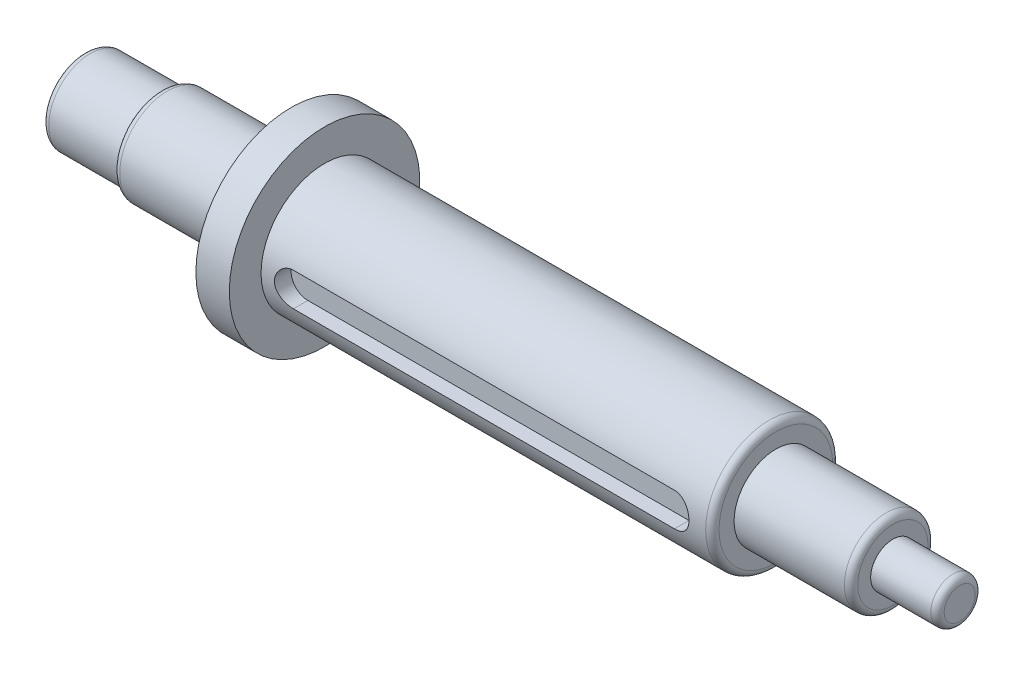
ISO-10303-21;
HEADER;
FILE_DESCRIPTION(('STEP AP214'),'2;1');
FILE_NAME('part.step','',(''),(''),'','','');
FILE_SCHEMA(('AUTOMOTIVE_DESIGN { 1 0 10303 214 1 1 1 1 }'));
ENDSEC;
DATA;
#1=APPLICATION_CONTEXT('core data for automotive mechanical design processes');
#2=APPLICATION_PROTOCOL_DEFINITION('international standard','automotive_design',2000,#1);
#3=PRODUCT_CONTEXT('',#1,'mechanical');
#4=PRODUCT('Part','Part','',(#3));
#5=PRODUCT_RELATED_PRODUCT_CATEGORY('part','',(#4));
#6=PRODUCT_DEFINITION_FORMATION('','',#4);
#7=PRODUCT_DEFINITION_CONTEXT('part definition',#1,'design');
#8=PRODUCT_DEFINITION('design','',#6,#7);
#9=PRODUCT_DEFINITION_SHAPE('','',#8);
#10=(LENGTH_UNIT() NAMED_UNIT(*) SI_UNIT(.MILLI.,.METRE.));
#11=(NAMED_UNIT(*) PLANE_ANGLE_UNIT() SI_UNIT($,.RADIAN.));
#12=(NAMED_UNIT(*) SI_UNIT($,.STERADIAN.) SOLID_ANGLE_UNIT());
#13=UNCERTAINTY_MEASURE_WITH_UNIT(LENGTH_MEASURE(1.E-05),#10,'distance_accuracy_value','');
#14=(GEOMETRIC_REPRESENTATION_CONTEXT(3) GLOBAL_UNCERTAINTY_ASSIGNED_CONTEXT((#13)) GLOBAL_UNIT_ASSIGNED_CONTEXT((#10,
#11,#12)) REPRESENTATION_CONTEXT('',''));
#15=CARTESIAN_POINT('',(0.,0.,0.));
#16=DIRECTION('',(0.,0.,1.));
#17=DIRECTION('',(1.,0.,0.));
#18=AXIS2_PLACEMENT_3D('',#15,#16,#17);
#19=CARTESIAN_POINT('',(0.,0.,0.));
#20=DIRECTION('',(1.,0.,0.));
#21=DIRECTION('',(0.,0.,-1.));
#22=AXIS2_PLACEMENT_3D('',#19,#20,#21);
#23=PLANE('',#22);
#24=CARTESIAN_POINT('',(0.,0.,0.));
#25=DIRECTION('',(1.,0.,0.));
#26=DIRECTION('',(0.,0.,-1.));
#27=AXIS2_PLACEMENT_3D('',#24,#25,#26);
#28=CIRCLE('',#27,10.5);
#29=CARTESIAN_POINT('',(0.,0.,-10.5));
#30=VERTEX_POINT('',#29);
#31=EDGE_CURVE('E147',#30,#30,#28,.F.);
#32=ORIENTED_EDGE('',*,*,#31,.T.);
#33=EDGE_LOOP('',(#32));
#34=FACE_BOUND('',#33,.T.);
#35=ADVANCED_FACE('F36',(#34),#23,.F.);
#36=CARTESIAN_POINT('',(0.,0.,0.));
#37=DIRECTION('',(-1.,0.,0.));
#38=DIRECTION('',(0.,0.,1.));
#39=AXIS2_PLACEMENT_3D('',#36,#37,#38);
#40=CYLINDRICAL_SURFACE('',#39,12.5);
#41=CARTESIAN_POINT('',(2.,0.,0.));
#42=DIRECTION('',(1.,0.,0.));
#43=DIRECTION('',(0.,0.,-1.));
#44=AXIS2_PLACEMENT_3D('',#41,#42,#43);
#45=CIRCLE('',#44,12.5);
#46=CARTESIAN_POINT('',(2.,0.,-12.5));
#47=VERTEX_POINT('',#46);
#48=EDGE_CURVE('E150',#47,#47,#45,.T.);
#49=ORIENTED_EDGE('',*,*,#48,.T.);
#50=EDGE_LOOP('',(#49));
#51=FACE_BOUND('',#50,.T.);
#52=CARTESIAN_POINT('',(23.,0.,0.));
#53=DIRECTION('',(-1.,0.,0.));
#54=DIRECTION('',(0.,0.,1.));
#55=AXIS2_PLACEMENT_3D('',#52,#53,#54);
#56=CIRCLE('',#55,12.5);
#57=CARTESIAN_POINT('',(23.,0.,12.5));
#58=VERTEX_POINT('',#57);
#59=EDGE_CURVE('E123',#58,#58,#56,.T.);
#60=ORIENTED_EDGE('',*,*,#59,.T.);
#61=EDGE_LOOP('',(#60));
#62=FACE_BOUND('',#61,.T.);
#63=ADVANCED_FACE('F209',(#51,#62),#40,.T.);
#64=CARTESIAN_POINT('',(0.,0.,0.));
#65=DIRECTION('',(-1.,0.,0.));
#66=DIRECTION('',(0.,0.,1.));
#67=AXIS2_PLACEMENT_3D('',#64,#65,#66);
#68=CYLINDRICAL_SURFACE('',#67,14.2499999999997);
#69=CARTESIAN_POINT('',(24.9843134832984,0.,0.));
#70=DIRECTION('',(-1.,0.,0.));
#71=DIRECTION('',(0.,0.,1.));
#72=AXIS2_PLACEMENT_3D('',#69,#70,#71);
#73=CIRCLE('',#72,14.2499999999997);
#74=CARTESIAN_POINT('',(24.9843134832984,0.,14.2499999999997));
#75=VERTEX_POINT('',#74);
#76=EDGE_CURVE('E144',#75,#75,#73,.F.);
#77=ORIENTED_EDGE('',*,*,#76,.T.);
#78=EDGE_LOOP('',(#77));
#79=FACE_BOUND('',#78,.T.);
#80=CARTESIAN_POINT('',(62.,0.,0.));
#81=DIRECTION('',(-1.,0.,0.));
#82=DIRECTION('',(0.,0.,1.));
#83=AXIS2_PLACEMENT_3D('',#80,#81,#82);
#84=CIRCLE('',#83,14.2499999999997);
#85=CARTESIAN_POINT('',(62.,0.,14.2499999999997));
#86=VERTEX_POINT('',#85);
#87=EDGE_CURVE('E120',#86,#86,#84,.T.);
#88=ORIENTED_EDGE('',*,*,#87,.T.);
#89=EDGE_LOOP('',(#88));
#90=FACE_BOUND('',#89,.T.);
#91=ADVANCED_FACE('F215',(#79,#90),#68,.T.);
#92=CARTESIAN_POINT('',(62.,0.,-14.2499999999997));
#93=DIRECTION('',(1.,0.,0.));
#94=DIRECTION('',(0.,0.,-1.));
#95=AXIS2_PLACEMENT_3D('',#92,#93,#94);
#96=PLANE('',#95);
#97=ORIENTED_EDGE('',*,*,#87,.F.);
#98=EDGE_LOOP('',(#97));
#99=FACE_BOUND('',#98,.T.);
#100=CARTESIAN_POINT('',(62.,0.,0.));
#101=DIRECTION('',(-1.,0.,0.));
#102=DIRECTION('',(0.,0.,1.));
#103=AXIS2_PLACEMENT_3D('',#100,#101,#102);
#104=CIRCLE('',#103,28.4999999999991);
#105=CARTESIAN_POINT('',(62.,0.,28.4999999999991));
#106=VERTEX_POINT('',#105);
#107=EDGE_CURVE('E117',#106,#106,#104,.T.);
#108=ORIENTED_EDGE('',*,*,#107,.T.);
#109=EDGE_LOOP('',(#108));
#110=FACE_BOUND('',#109,.T.);
#111=ADVANCED_FACE('F244',(#99,#110),#96,.F.);
#112=CARTESIAN_POINT('',(0.,0.,0.));
#113=DIRECTION('',(-1.,0.,0.));
#114=DIRECTION('',(0.,0.,1.));
#115=AXIS2_PLACEMENT_3D('',#112,#113,#114);
#116=CYLINDRICAL_SURFACE('',#115,28.4999999999996);
#117=ORIENTED_EDGE('',*,*,#107,.F.);
#118=EDGE_LOOP('',(#117));
#119=FACE_BOUND('',#118,.T.);
#120=CARTESIAN_POINT('',(72.,0.,0.));
#121=DIRECTION('',(-1.,0.,0.));
#122=DIRECTION('',(0.,0.,1.));
#123=AXIS2_PLACEMENT_3D('',#120,#121,#122);
#124=CIRCLE('',#123,28.5);
#125=CARTESIAN_POINT('',(72.,0.,28.5));
#126=VERTEX_POINT('',#125);
#127=EDGE_CURVE('E114',#126,#126,#124,.T.);
#128=ORIENTED_EDGE('',*,*,#127,.T.);
#129=EDGE_LOOP('',(#128));
#130=FACE_BOUND('',#129,.T.);
#131=ADVANCED_FACE('F249',(#119,#130),#116,.T.);
#132=CARTESIAN_POINT('',(72.,0.,-28.5));
#133=DIRECTION('',(-1.,0.,0.));
#134=DIRECTION('',(0.,0.,1.));
#135=AXIS2_PLACEMENT_3D('',#132,#133,#134);
#136=PLANE('',#135);
#137=ORIENTED_EDGE('',*,*,#127,.F.);
#138=EDGE_LOOP('',(#137));
#139=FACE_BOUND('',#138,.T.);
#140=CARTESIAN_POINT('',(72.,0.,0.));
#141=DIRECTION('',(-1.,0.,0.));
#142=DIRECTION('',(0.,0.,1.));
#143=AXIS2_PLACEMENT_3D('',#140,#141,#142);
#144=CIRCLE('',#143,19.);
#145=CARTESIAN_POINT('',(72.,0.,19.));
#146=VERTEX_POINT('',#145);
#147=EDGE_CURVE('E111',#146,#146,#144,.T.);
#148=ORIENTED_EDGE('',*,*,#147,.T.);
#149=EDGE_LOOP('',(#148));
#150=FACE_BOUND('',#149,.T.);
#151=ADVANCED_FACE('F205',(#139,#150),#136,.F.);
#152=CARTESIAN_POINT('',(0.,0.,0.));
#153=DIRECTION('',(-1.,0.,0.));
#154=DIRECTION('',(0.,0.,1.));
#155=AXIS2_PLACEMENT_3D('',#152,#153,#154);
#156=CYLINDRICAL_SURFACE('',#155,19.);
#157=DIRECTION('',(-1.,0.,0.));
#158=VECTOR('',#157,1.);
#159=CARTESIAN_POINT('',(0.,5.,18.3303027798234));
#160=LINE('',#159,#158);
#161=CARTESIAN_POINT('',(81.,5.,18.3303027798234));
#162=VERTEX_POINT('',#161);
#163=CARTESIAN_POINT('',(195.,5.,18.3303027798234));
#164=VERTEX_POINT('',#163);
#165=EDGE_CURVE('E11',#162,#164,#160,.F.);
#166=ORIENTED_EDGE('',*,*,#165,.T.);
#167=CARTESIAN_POINT('',(195.,5.,18.3303027798234));
#168=CARTESIAN_POINT('',(195.138016197201,5.00001766668261,18.3302859082857));
#169=CARTESIAN_POINT('',(195.276026196084,4.9942862066955,18.3318609913296));
#170=CARTESIAN_POINT('',(195.551009053571,4.97145574831055,18.3380720236008));
#171=CARTESIAN_POINT('',(195.687982096282,4.95435881807958,18.3427074159445));
#172=CARTESIAN_POINT('',(195.959630101042,4.90897601752026,18.3549032155987));
#173=CARTESIAN_POINT('',(196.094309305362,4.88071385252822,18.3624574251155));
#174=CARTESIAN_POINT('',(196.360713798261,4.81324620313061,18.3802580223183));
#175=CARTESIAN_POINT('',(196.492439037366,4.77404053558504,18.3905044550585));
#176=CARTESIAN_POINT('',(196.751988221275,4.68501289335865,18.4133853968542));
#177=CARTESIAN_POINT('',(196.879813631962,4.63519496528777,18.4260189954416));
#178=CARTESIAN_POINT('',(197.130780361131,4.52532553542391,18.4533094170246));
#179=CARTESIAN_POINT('',(197.253919920243,4.4652702353424,18.4679669905744));
#180=CARTESIAN_POINT('',(197.615064428344,4.27037749337004,18.5143659713688));
#181=CARTESIAN_POINT('',(197.844987340861,4.12074697519633,18.5485515146361));
#182=CARTESIAN_POINT('',(198.281689372965,3.78266195018416,18.6204696894086));
#183=CARTESIAN_POINT('',(198.487853211862,3.59343075278062,18.658263492612));
#184=CARTESIAN_POINT('',(198.865962445014,3.18310193538118,18.732625835079));
#185=CARTESIAN_POINT('',(199.037902303546,2.96199917012089,18.76919417533));
#186=CARTESIAN_POINT('',(199.345179414361,2.48996924780925,18.8376675811324));
#187=CARTESIAN_POINT('',(199.47990528927,2.23863143936238,18.8694912031433));
#188=CARTESIAN_POINT('',(199.704953482289,1.71590637997249,18.9241806310349));
#189=CARTESIAN_POINT('',(199.795285199543,1.44452338700981,18.9470483328572));
#190=CARTESIAN_POINT('',(199.92699709216,0.895832897884265,18.9808144065777));
#191=CARTESIAN_POINT('',(199.969425143628,0.618792947064016,18.9919686097243));
#192=CARTESIAN_POINT('',(200.007420968747,0.0613112052362544,19.0019448285789));
#193=CARTESIAN_POINT('',(200.002995365607,-0.219130099359579,19.0007685873121));
#194=CARTESIAN_POINT('',(199.948151367512,-0.768151117298725,18.9864044979906));
#195=CARTESIAN_POINT('',(199.898865805523,-1.03685296683871,18.9735125161181));
#196=CARTESIAN_POINT('',(199.757520254621,-1.562032997849,18.9375121568335));
#197=CARTESIAN_POINT('',(199.665458264849,-1.81851060691425,18.9144033015318));
#198=CARTESIAN_POINT('',(199.440328822091,-2.3148475496931,18.8601298911963));
#199=CARTESIAN_POINT('',(199.306869759603,-2.55452016615558,18.8288888816724));
#200=CARTESIAN_POINT('',(199.002903285257,-3.00854301144997,18.7616994100197));
#201=CARTESIAN_POINT('',(198.832389585279,-3.22288893283456,18.7257501493189));
#202=CARTESIAN_POINT('',(198.549627331325,-3.52419659305494,18.6705907034911));
#203=CARTESIAN_POINT('',(198.449181247553,-3.62255621938199,18.6517101060183));
#204=CARTESIAN_POINT('',(198.240350624317,-3.81048914275926,18.6142238908637));
#205=CARTESIAN_POINT('',(198.131968878581,-3.90006550620352,18.595618179155));
#206=CARTESIAN_POINT('',(197.907893486203,-4.06988196131281,18.5591922415691));
#207=CARTESIAN_POINT('',(197.792195054692,-4.15011584380694,18.5413725429207));
#208=CARTESIAN_POINT('',(197.55434791851,-4.30059289814721,18.5070487697456));
#209=CARTESIAN_POINT('',(197.432201736368,-4.3708399379606,18.4905441869608));
#210=CARTESIAN_POINT('',(197.18137777788,-4.50130100976656,18.4592205654969));
#211=CARTESIAN_POINT('',(197.052661056413,-4.56144316630362,18.4444138217068));
#212=CARTESIAN_POINT('',(196.79041951867,-4.67060599397033,18.4170737812662));
#213=CARTESIAN_POINT('',(196.656896658259,-4.71963113120058,18.4045395720651));
#214=CARTESIAN_POINT('',(196.386096701654,-4.80613348025077,18.3821401987773));
#215=CARTESIAN_POINT('',(196.248823661148,-4.84362266837274,18.3722722679413));
#216=CARTESIAN_POINT('',(195.971463873974,-4.90677851660471,18.3555057309761));
#217=CARTESIAN_POINT('',(195.831378472033,-4.93245069281332,18.3486057395322));
#218=CARTESIAN_POINT('',(195.576031992547,-4.96805016310397,18.3389956133326));
#219=CARTESIAN_POINT('',(195.461073574541,-4.98003415018343,18.3357406080542));
#220=CARTESIAN_POINT('',(195.230746570727,-4.99600639007608,18.3313920220704));
#221=CARTESIAN_POINT('',(195.115378930817,-5.00000735763538,18.3302950043258));
#222=CARTESIAN_POINT('',(195.,-5.,18.3303027798234));
#223=B_SPLINE_CURVE_WITH_KNOTS('',3,(#167,#168,#169,#170,#171,#172,#173,#174,#175,#176,#177,
#178,#179,#180,#181,#182,#183,#184,#185,#186,#187,#188,#189,#190,#191,#192,#193,#194,#195,#196,
#197,#198,#199,#200,#201,#202,#203,#204,#205,#206,#207,#208,#209,#210,#211,#212,#213,#214,#215,
#216,#217,#218,#219,#220,#221,#222),.UNSPECIFIED.,.F.,.F.,(4,2,2,2,2,2,2,2,2,2,2,2,2,2,2,2,2,2,
2,2,2,2,2,2,2,2,2,4),(0.,0.413911055875678,0.827746813248318,1.24070862177833,1.65367734165684,
2.06648887151099,2.47945389814992,3.30477934860257,4.14813364543848,4.99162424403129,
5.84824381544334,6.70468194490244,7.54199904887894,8.3791977917408,9.19582441640862,
10.0124892424595,10.8371281703848,11.6619071478274,12.0870382665453,12.5120204319564,
12.9372834547274,13.3623813190941,13.7903854272744,14.2182172852097,14.6456034696819,
15.0727899504498,15.4193832237595,15.7654240276075),.UNSPECIFIED.);
#224=CARTESIAN_POINT('',(195.,-5.,18.3303027798234));
#225=VERTEX_POINT('',#224);
#226=EDGE_CURVE('E153',#164,#225,#223,.T.);
#227=ORIENTED_EDGE('',*,*,#226,.T.);
#228=DIRECTION('',(-1.,0.,0.));
#229=VECTOR('',#228,1.);
#230=CARTESIAN_POINT('',(0.,-5.,18.3303027798234));
#231=LINE('',#230,#229);
#232=CARTESIAN_POINT('',(81.,-5.,18.3303027798234));
#233=VERTEX_POINT('',#232);
#234=EDGE_CURVE('E44',#225,#233,#231,.T.);
#235=ORIENTED_EDGE('',*,*,#234,.T.);
#236=CARTESIAN_POINT('',(81.,-5.,18.3303027798234));
#237=CARTESIAN_POINT('',(80.8619838027993,-5.00001766668261,18.3302859082857));
#238=CARTESIAN_POINT('',(80.7239738039157,-4.9942862066955,18.3318609913296));
#239=CARTESIAN_POINT('',(80.4489909464293,-4.97145574831054,18.3380720236008));
#240=CARTESIAN_POINT('',(80.3120179037179,-4.95435881807958,18.3427074159445));
#241=CARTESIAN_POINT('',(80.0403698989582,-4.90897601752026,18.3549032155987));
#242=CARTESIAN_POINT('',(79.9056906946382,-4.88071385252822,18.3624574251155));
#243=CARTESIAN_POINT('',(79.6392862017387,-4.8132462031306,18.3802580223183));
#244=CARTESIAN_POINT('',(79.5075609626339,-4.77404053558503,18.3905044550585));
#245=CARTESIAN_POINT('',(79.2480117787245,-4.68501289335864,18.4133853968542));
#246=CARTESIAN_POINT('',(79.1201863680384,-4.63519496528777,18.4260189954416));
#247=CARTESIAN_POINT('',(78.8692196388691,-4.5253255354239,18.4533094170246));
#248=CARTESIAN_POINT('',(78.7460800797571,-4.46527023534238,18.4679669905744));
#249=CARTESIAN_POINT('',(78.3849355716565,-4.27037749337002,18.5143659713688));
#250=CARTESIAN_POINT('',(78.1550126591395,-4.12074697519632,18.5485515146361));
#251=CARTESIAN_POINT('',(77.7183106270352,-3.78266195018417,18.6204696894086));
#252=CARTESIAN_POINT('',(77.5121467881376,-3.59343075278062,18.658263492612));
#253=CARTESIAN_POINT('',(77.1340375549857,-3.18310193538118,18.732625835079));
#254=CARTESIAN_POINT('',(76.9620976964542,-2.9619991701209,18.76919417533));
#255=CARTESIAN_POINT('',(76.6548205856393,-2.48996924780925,18.8376675811324));
#256=CARTESIAN_POINT('',(76.5200947107301,-2.23863143936237,18.8694912031433));
#257=CARTESIAN_POINT('',(76.2950465177109,-1.71590637997248,18.9241806310349));
#258=CARTESIAN_POINT('',(76.2047148004574,-1.44452338700979,18.9470483328572));
#259=CARTESIAN_POINT('',(76.0730029078404,-0.895832897884248,18.9808144065777));
#260=CARTESIAN_POINT('',(76.0305748563723,-0.618792947064001,18.9919686097243));
#261=CARTESIAN_POINT('',(75.9925790312525,-0.0613112052362446,19.0019448285789));
#262=CARTESIAN_POINT('',(75.9970046343934,0.219130099359585,19.0007685873121));
#263=CARTESIAN_POINT('',(76.0518486324882,0.768151117298726,18.9864044979906));
#264=CARTESIAN_POINT('',(76.1011341944768,1.03685296683871,18.9735125161181));
#265=CARTESIAN_POINT('',(76.2424797453791,1.56203299784899,18.9375121568335));
#266=CARTESIAN_POINT('',(76.3345417351512,1.81851060691424,18.9144033015318));
#267=CARTESIAN_POINT('',(76.5596711779087,2.3148475496931,18.8601298911963));
#268=CARTESIAN_POINT('',(76.6931302403975,2.55452016615559,18.8288888816724));
#269=CARTESIAN_POINT('',(76.9970967147432,3.00854301144998,18.7616994100197));
#270=CARTESIAN_POINT('',(77.1676104147209,3.22288893283458,18.7257501493189));
#271=CARTESIAN_POINT('',(77.4503726686754,3.52419659305494,18.6705907034911));
#272=CARTESIAN_POINT('',(77.5508187524467,3.62255621938198,18.6517101060183));
#273=CARTESIAN_POINT('',(77.7596493756834,3.81048914275925,18.6142238908637));
#274=CARTESIAN_POINT('',(77.8680311214193,3.90006550620351,18.5956181791551));
#275=CARTESIAN_POINT('',(78.0921065137967,4.0698819613128,18.5591922415691));
#276=CARTESIAN_POINT('',(78.2078049453085,4.15011584380694,18.5413725429207));
#277=CARTESIAN_POINT('',(78.4456520814902,4.3005928981472,18.5070487697456));
#278=CARTESIAN_POINT('',(78.5677982636319,4.37083993796059,18.4905441869608));
#279=CARTESIAN_POINT('',(78.8186222221203,4.50130100976655,18.4592205654969));
#280=CARTESIAN_POINT('',(78.9473389435871,4.56144316630361,18.4444138217068));
#281=CARTESIAN_POINT('',(79.2095804813299,4.67060599397032,18.4170737812662));
#282=CARTESIAN_POINT('',(79.3431033417405,4.71963113120057,18.4045395720651));
#283=CARTESIAN_POINT('',(79.6139032983456,4.80613348025077,18.3821401987773));
#284=CARTESIAN_POINT('',(79.7511763388523,4.84362266837273,18.3722722679413));
#285=CARTESIAN_POINT('',(80.028536126026,4.90677851660471,18.3555057309761));
#286=CARTESIAN_POINT('',(80.1686215279673,4.93245069281332,18.3486057395322));
#287=CARTESIAN_POINT('',(80.423968007453,4.96805016310397,18.3389956133326));
#288=CARTESIAN_POINT('',(80.5389264254594,4.98003415018343,18.3357406080542));
#289=CARTESIAN_POINT('',(80.7692534292732,4.99600639007608,18.3313920220704));
#290=CARTESIAN_POINT('',(80.884621069183,5.00000735763538,18.3302950043258));
#291=CARTESIAN_POINT('',(81.,5.,18.3303027798234));
#292=B_SPLINE_CURVE_WITH_KNOTS('',3,(#236,#237,#238,#239,#240,#241,#242,#243,#244,#245,#246,
#247,#248,#249,#250,#251,#252,#253,#254,#255,#256,#257,#258,#259,#260,#261,#262,#263,#264,#265,
#266,#267,#268,#269,#270,#271,#272,#273,#274,#275,#276,#277,#278,#279,#280,#281,#282,#283,#284,
#285,#286,#287,#288,#289,#290,#291),.UNSPECIFIED.,.F.,.F.,(4,2,2,2,2,2,2,2,2,2,2,2,2,2,2,2,2,2,
2,2,2,2,2,2,2,2,2,4),(0.,0.413911055875692,0.827746813248346,1.24070862177839,1.65367734165684,
2.06648887151102,2.47945389814994,3.30477934860257,4.14813364543846,4.99162424403128,
5.84824381544335,6.70468194490246,7.54199904887896,8.37919779174081,9.19582441640863,
10.0124892424595,10.8371281703848,11.6619071478275,12.0870382665453,12.5120204319564,
12.9372834547274,13.3623813190941,13.7903854272744,14.2182172852097,14.6456034696819,
15.0727899504498,15.4193832237595,15.7654240276075),.UNSPECIFIED.);
#293=EDGE_CURVE('E51',#233,#162,#292,.T.);
#294=ORIENTED_EDGE('',*,*,#293,.T.);
#295=EDGE_LOOP('',(#166,#227,#235,#294));
#296=FACE_BOUND('',#295,.T.);
#297=CARTESIAN_POINT('',(205.,0.,0.));
#298=DIRECTION('',(-1.,0.,0.));
#299=DIRECTION('',(0.,0.,1.));
#300=AXIS2_PLACEMENT_3D('',#297,#298,#299);
#301=CIRCLE('',#300,19.);
#302=CARTESIAN_POINT('',(205.,0.,19.));
#303=VERTEX_POINT('',#302);
#304=EDGE_CURVE('E138',#303,#303,#301,.T.);
#305=ORIENTED_EDGE('',*,*,#304,.T.);
#306=EDGE_LOOP('',(#305));
#307=FACE_BOUND('',#306,.T.);
#308=ORIENTED_EDGE('',*,*,#147,.F.);
#309=EDGE_LOOP('',(#308));
#310=FACE_BOUND('',#309,.T.);
#311=ADVANCED_FACE('F167',(#296,#307,#310),#156,.T.);
#312=CARTESIAN_POINT('',(207.,0.,-19.));
#313=DIRECTION('',(-1.,0.,0.));
#314=DIRECTION('',(0.,0.,1.));
#315=AXIS2_PLACEMENT_3D('',#312,#313,#314);
#316=PLANE('',#315);
#317=CARTESIAN_POINT('',(207.,0.,0.));
#318=DIRECTION('',(-1.,0.,0.));
#319=DIRECTION('',(0.,0.,1.));
#320=AXIS2_PLACEMENT_3D('',#317,#318,#319);
#321=CIRCLE('',#320,17.);
#322=CARTESIAN_POINT('',(207.,0.,17.));
#323=VERTEX_POINT('',#322);
#324=EDGE_CURVE('E141',#323,#323,#321,.F.);
#325=ORIENTED_EDGE('',*,*,#324,.T.);
#326=EDGE_LOOP('',(#325));
#327=FACE_BOUND('',#326,.T.);
#328=CARTESIAN_POINT('',(207.,0.,0.));
#329=DIRECTION('',(-1.,0.,0.));
#330=DIRECTION('',(0.,0.,1.));
#331=AXIS2_PLACEMENT_3D('',#328,#329,#330);
#332=CIRCLE('',#331,12.5);
#333=CARTESIAN_POINT('',(207.,0.,12.5));
#334=VERTEX_POINT('',#333);
#335=EDGE_CURVE('E108',#334,#334,#332,.T.);
#336=ORIENTED_EDGE('',*,*,#335,.T.);
#337=EDGE_LOOP('',(#336));
#338=FACE_BOUND('',#337,.T.);
#339=ADVANCED_FACE('F198',(#327,#338),#316,.F.);
#340=CARTESIAN_POINT('',(0.,0.,0.));
#341=DIRECTION('',(-1.,0.,0.));
#342=DIRECTION('',(0.,0.,1.));
#343=AXIS2_PLACEMENT_3D('',#340,#341,#342);
#344=CYLINDRICAL_SURFACE('',#343,12.5);
#345=CARTESIAN_POINT('',(240.,0.,0.));
#346=DIRECTION('',(-1.,0.,0.));
#347=DIRECTION('',(0.,0.,1.));
#348=AXIS2_PLACEMENT_3D('',#345,#346,#347);
#349=CIRCLE('',#348,12.5);
#350=CARTESIAN_POINT('',(240.,0.,12.5));
#351=VERTEX_POINT('',#350);
#352=EDGE_CURVE('E132',#351,#351,#349,.T.);
#353=ORIENTED_EDGE('',*,*,#352,.T.);
#354=EDGE_LOOP('',(#353));
#355=FACE_BOUND('',#354,.T.);
#356=ORIENTED_EDGE('',*,*,#335,.F.);
#357=EDGE_LOOP('',(#356));
#358=FACE_BOUND('',#357,.T.);
#359=ADVANCED_FACE('F195',(#355,#358),#344,.T.);
#360=CARTESIAN_POINT('',(242.,0.,-12.5));
#361=DIRECTION('',(-1.,0.,0.));
#362=DIRECTION('',(0.,0.,1.));
#363=AXIS2_PLACEMENT_3D('',#360,#361,#362);
#364=PLANE('',#363);
#365=CARTESIAN_POINT('',(242.,0.,0.));
#366=DIRECTION('',(-1.,0.,0.));
#367=DIRECTION('',(0.,0.,1.));
#368=AXIS2_PLACEMENT_3D('',#365,#366,#367);
#369=CIRCLE('',#368,10.5);
#370=CARTESIAN_POINT('',(242.,0.,10.5));
#371=VERTEX_POINT('',#370);
#372=EDGE_CURVE('E135',#371,#371,#369,.F.);
#373=ORIENTED_EDGE('',*,*,#372,.T.);
#374=EDGE_LOOP('',(#373));
#375=FACE_BOUND('',#374,.T.);
#376=CARTESIAN_POINT('',(242.,0.,0.));
#377=DIRECTION('',(-1.,0.,0.));
#378=DIRECTION('',(0.,0.,1.));
#379=AXIS2_PLACEMENT_3D('',#376,#377,#378);
#380=CIRCLE('',#379,6.65);
#381=CARTESIAN_POINT('',(242.,0.,6.65));
#382=VERTEX_POINT('',#381);
#383=EDGE_CURVE('E102',#382,#382,#380,.T.);
#384=ORIENTED_EDGE('',*,*,#383,.T.);
#385=EDGE_LOOP('',(#384));
#386=FACE_BOUND('',#385,.T.);
#387=ADVANCED_FACE('F191',(#375,#386),#364,.F.);
#388=CARTESIAN_POINT('',(0.,0.,0.));
#389=DIRECTION('',(-1.,0.,0.));
#390=DIRECTION('',(0.,0.,1.));
#391=AXIS2_PLACEMENT_3D('',#388,#389,#390);
#392=CYLINDRICAL_SURFACE('',#391,6.65);
#393=CARTESIAN_POINT('',(260.,0.,0.));
#394=DIRECTION('',(-1.,0.,0.));
#395=DIRECTION('',(0.,0.,1.));
#396=AXIS2_PLACEMENT_3D('',#393,#394,#395);
#397=CIRCLE('',#396,6.65);
#398=CARTESIAN_POINT('',(260.,0.,6.65));
#399=VERTEX_POINT('',#398);
#400=EDGE_CURVE('E126',#399,#399,#397,.T.);
#401=ORIENTED_EDGE('',*,*,#400,.T.);
#402=EDGE_LOOP('',(#401));
#403=FACE_BOUND('',#402,.T.);
#404=ORIENTED_EDGE('',*,*,#383,.F.);
#405=EDGE_LOOP('',(#404));
#406=FACE_BOUND('',#405,.T.);
#407=ADVANCED_FACE('F187',(#403,#406),#392,.T.);
#408=CARTESIAN_POINT('',(262.,0.,-6.65));
#409=DIRECTION('',(-1.,0.,0.));
#410=DIRECTION('',(0.,0.,1.));
#411=AXIS2_PLACEMENT_3D('',#408,#409,#410);
#412=PLANE('',#411);
#413=CARTESIAN_POINT('',(262.,0.,0.));
#414=DIRECTION('',(-1.,0.,0.));
#415=DIRECTION('',(0.,0.,1.));
#416=AXIS2_PLACEMENT_3D('',#413,#414,#415);
#417=CIRCLE('',#416,4.65);
#418=CARTESIAN_POINT('',(262.,0.,4.65));
#419=VERTEX_POINT('',#418);
#420=EDGE_CURVE('E129',#419,#419,#417,.F.);
#421=ORIENTED_EDGE('',*,*,#420,.T.);
#422=EDGE_LOOP('',(#421));
#423=FACE_BOUND('',#422,.T.);
#424=ADVANCED_FACE('F183',(#423),#412,.F.);
#425=CARTESIAN_POINT('',(260.,0.,0.));
#426=DIRECTION('',(-1.,0.,0.));
#427=DIRECTION('',(0.,0.,1.));
#428=AXIS2_PLACEMENT_3D('',#425,#426,#427);
#429=TOROIDAL_SURFACE('',#428,4.65,2.);
#430=ORIENTED_EDGE('',*,*,#420,.F.);
#431=EDGE_LOOP('',(#430));
#432=FACE_BOUND('',#431,.T.);
#433=ORIENTED_EDGE('',*,*,#400,.F.);
#434=EDGE_LOOP('',(#433));
#435=FACE_BOUND('',#434,.T.);
#436=ADVANCED_FACE('F186',(#432,#435),#429,.T.);
#437=CARTESIAN_POINT('',(240.,0.,0.));
#438=DIRECTION('',(-1.,0.,0.));
#439=DIRECTION('',(0.,0.,1.));
#440=AXIS2_PLACEMENT_3D('',#437,#438,#439);
#441=TOROIDAL_SURFACE('',#440,10.5,2.);
#442=ORIENTED_EDGE('',*,*,#372,.F.);
#443=EDGE_LOOP('',(#442));
#444=FACE_BOUND('',#443,.T.);
#445=ORIENTED_EDGE('',*,*,#352,.F.);
#446=EDGE_LOOP('',(#445));
#447=FACE_BOUND('',#446,.T.);
#448=ADVANCED_FACE('F222',(#444,#447),#441,.T.);
#449=CARTESIAN_POINT('',(205.,0.,0.));
#450=DIRECTION('',(-1.,0.,0.));
#451=DIRECTION('',(0.,0.,1.));
#452=AXIS2_PLACEMENT_3D('',#449,#450,#451);
#453=TOROIDAL_SURFACE('',#452,17.,2.);
#454=ORIENTED_EDGE('',*,*,#324,.F.);
#455=EDGE_LOOP('',(#454));
#456=FACE_BOUND('',#455,.T.);
#457=ORIENTED_EDGE('',*,*,#304,.F.);
#458=EDGE_LOOP('',(#457));
#459=FACE_BOUND('',#458,.T.);
#460=ADVANCED_FACE('F226',(#456,#459),#453,.T.);
#461=CARTESIAN_POINT('',(24.9843134832984,0.,0.));
#462=DIRECTION('',(-1.,0.,0.));
#463=DIRECTION('',(0.,0.,1.));
#464=AXIS2_PLACEMENT_3D('',#461,#462,#463);
#465=TOROIDAL_SURFACE('',#464,12.2499999999997,2.);
#466=ORIENTED_EDGE('',*,*,#76,.F.);
#467=EDGE_LOOP('',(#466));
#468=FACE_BOUND('',#467,.T.);
#469=ORIENTED_EDGE('',*,*,#59,.F.);
#470=EDGE_LOOP('',(#469));
#471=FACE_BOUND('',#470,.T.);
#472=ADVANCED_FACE('F229',(#468,#471),#465,.T.);
#473=CARTESIAN_POINT('',(2.,0.,0.));
#474=DIRECTION('',(1.,0.,0.));
#475=DIRECTION('',(0.,0.,-1.));
#476=AXIS2_PLACEMENT_3D('',#473,#474,#475);
#477=TOROIDAL_SURFACE('',#476,10.5,2.);
#478=ORIENTED_EDGE('',*,*,#48,.F.);
#479=EDGE_LOOP('',(#478));
#480=FACE_BOUND('',#479,.T.);
#481=ORIENTED_EDGE('',*,*,#31,.F.);
#482=EDGE_LOOP('',(#481));
#483=FACE_BOUND('',#482,.T.);
#484=ADVANCED_FACE('F38',(#480,#483),#477,.T.);
#485=CARTESIAN_POINT('',(81.,0.,14.));
#486=DIRECTION('',(0.,0.,1.));
#487=DIRECTION('',(1.,0.,0.));
#488=AXIS2_PLACEMENT_3D('',#485,#486,#487);
#489=CYLINDRICAL_SURFACE('',#488,5.);
#490=DIRECTION('',(0.,0.,1.));
#491=VECTOR('',#490,1.);
#492=CARTESIAN_POINT('',(81.,-5.,14.));
#493=LINE('',#492,#491);
#494=CARTESIAN_POINT('',(81.,-5.,14.));
#495=VERTEX_POINT('',#494);
#496=EDGE_CURVE('E74',#495,#233,#493,.T.);
#497=ORIENTED_EDGE('',*,*,#496,.F.);
#498=CARTESIAN_POINT('',(81.,0.,14.));
#499=DIRECTION('',(0.,0.,1.));
#500=DIRECTION('',(1.,0.,0.));
#501=AXIS2_PLACEMENT_3D('',#498,#499,#500);
#502=CIRCLE('',#501,5.);
#503=CARTESIAN_POINT('',(81.,5.,14.));
#504=VERTEX_POINT('',#503);
#505=EDGE_CURVE('E78',#504,#495,#502,.T.);
#506=ORIENTED_EDGE('',*,*,#505,.F.);
#507=DIRECTION('',(0.,0.,1.));
#508=VECTOR('',#507,1.);
#509=CARTESIAN_POINT('',(81.,5.,14.));
#510=LINE('',#509,#508);
#511=EDGE_CURVE('E100',#504,#162,#510,.T.);
#512=ORIENTED_EDGE('',*,*,#511,.T.);
#513=ORIENTED_EDGE('',*,*,#293,.F.);
#514=EDGE_LOOP('',(#497,#506,#512,#513));
#515=FACE_BOUND('',#514,.T.);
#516=ADVANCED_FACE('F76',(#515),#489,.F.);
#517=CARTESIAN_POINT('',(81.,5.,14.));
#518=DIRECTION('',(0.,1.,0.));
#519=DIRECTION('',(0.,0.,1.));
#520=AXIS2_PLACEMENT_3D('',#517,#518,#519);
#521=PLANE('',#520);
#522=ORIENTED_EDGE('',*,*,#511,.F.);
#523=DIRECTION('',(-1.,0.,0.));
#524=VECTOR('',#523,1.);
#525=CARTESIAN_POINT('',(81.,5.,14.));
#526=LINE('',#525,#524);
#527=CARTESIAN_POINT('',(195.,5.,14.));
#528=VERTEX_POINT('',#527);
#529=EDGE_CURVE('E83',#528,#504,#526,.T.);
#530=ORIENTED_EDGE('',*,*,#529,.F.);
#531=DIRECTION('',(0.,0.,1.));
#532=VECTOR('',#531,1.);
#533=CARTESIAN_POINT('',(195.,5.,14.));
#534=LINE('',#533,#532);
#535=EDGE_CURVE('E103',#528,#164,#534,.T.);
#536=ORIENTED_EDGE('',*,*,#535,.T.);
#537=ORIENTED_EDGE('',*,*,#165,.F.);
#538=EDGE_LOOP('',(#522,#530,#536,#537));
#539=FACE_BOUND('',#538,.T.);
#540=ADVANCED_FACE('F176',(#539),#521,.F.);
#541=CARTESIAN_POINT('',(195.,0.,14.));
#542=DIRECTION('',(0.,0.,1.));
#543=DIRECTION('',(1.,0.,0.));
#544=AXIS2_PLACEMENT_3D('',#541,#542,#543);
#545=CYLINDRICAL_SURFACE('',#544,5.);
#546=ORIENTED_EDGE('',*,*,#535,.F.);
#547=CARTESIAN_POINT('',(195.,0.,14.));
#548=DIRECTION('',(0.,0.,1.));
#549=DIRECTION('',(1.,0.,0.));
#550=AXIS2_PLACEMENT_3D('',#547,#548,#549);
#551=CIRCLE('',#550,5.);
#552=CARTESIAN_POINT('',(195.,-5.,14.));
#553=VERTEX_POINT('',#552);
#554=EDGE_CURVE('E92',#553,#528,#551,.T.);
#555=ORIENTED_EDGE('',*,*,#554,.F.);
#556=DIRECTION('',(0.,0.,1.));
#557=VECTOR('',#556,1.);
#558=CARTESIAN_POINT('',(195.,-5.,14.));
#559=LINE('',#558,#557);
#560=EDGE_CURVE('E82',#553,#225,#559,.T.);
#561=ORIENTED_EDGE('',*,*,#560,.T.);
#562=ORIENTED_EDGE('',*,*,#226,.F.);
#563=EDGE_LOOP('',(#546,#555,#561,#562));
#564=FACE_BOUND('',#563,.T.);
#565=ADVANCED_FACE('F171',(#564),#545,.F.);
#566=CARTESIAN_POINT('',(81.,-5.,14.));
#567=DIRECTION('',(0.,-1.,0.));
#568=DIRECTION('',(0.,0.,-1.));
#569=AXIS2_PLACEMENT_3D('',#566,#567,#568);
#570=PLANE('',#569);
#571=ORIENTED_EDGE('',*,*,#560,.F.);
#572=DIRECTION('',(1.,0.,0.));
#573=VECTOR('',#572,1.);
#574=CARTESIAN_POINT('',(81.,-5.,14.));
#575=LINE('',#574,#573);
#576=EDGE_CURVE('E86',#495,#553,#575,.T.);
#577=ORIENTED_EDGE('',*,*,#576,.F.);
#578=ORIENTED_EDGE('',*,*,#496,.T.);
#579=ORIENTED_EDGE('',*,*,#234,.F.);
#580=EDGE_LOOP('',(#571,#577,#578,#579));
#581=FACE_BOUND('',#580,.T.);
#582=ADVANCED_FACE('F87',(#581),#570,.F.);
#583=CARTESIAN_POINT('',(81.,0.,14.));
#584=DIRECTION('',(0.,0.,1.));
#585=DIRECTION('',(1.,0.,0.));
#586=AXIS2_PLACEMENT_3D('',#583,#584,#585);
#587=PLANE('',#586);
#588=ORIENTED_EDGE('',*,*,#505,.T.);
#589=ORIENTED_EDGE('',*,*,#576,.T.);
#590=ORIENTED_EDGE('',*,*,#554,.T.);
#591=ORIENTED_EDGE('',*,*,#529,.T.);
#592=EDGE_LOOP('',(#588,#589,#590,#591));
#593=FACE_BOUND('',#592,.T.);
#594=ADVANCED_FACE('F94',(#593),#587,.T.);
#595=CLOSED_SHELL('',(#35,#63,#91,#111,#131,#151,#311,#339,#359,#387,#407,#424,#436,#448,#460,
#472,#484,#516,#540,#565,#582,#594));
#596=MANIFOLD_SOLID_BREP('B2',#595);
#597=ADVANCED_BREP_SHAPE_REPRESENTATION('',(#18,#596),#14);
#598=SHAPE_DEFINITION_REPRESENTATION(#9,#597);
ENDSEC;
END-ISO-10303-21;
